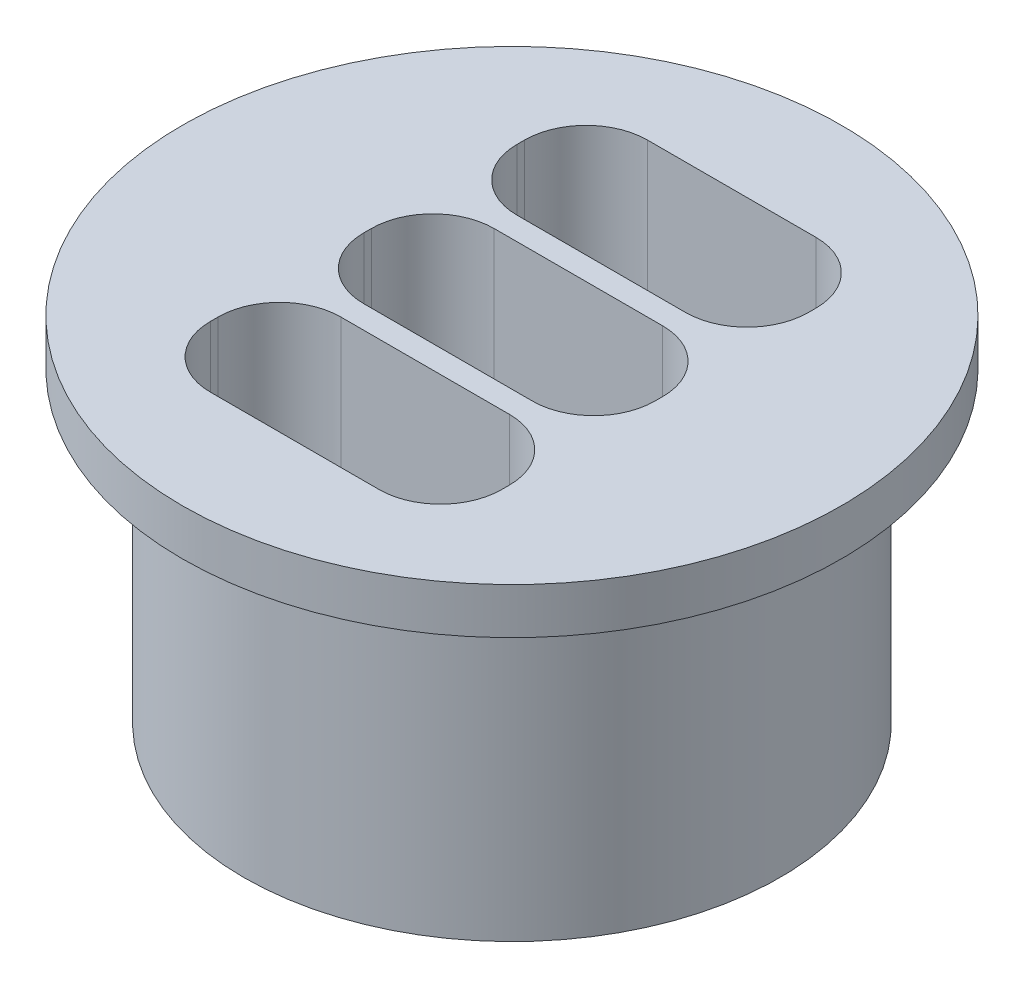
ISO-10303-21;
HEADER;
FILE_DESCRIPTION(('STEP AP214'),'2;1');
FILE_NAME('part.step','',(''),(''),'','','');
FILE_SCHEMA(('AUTOMOTIVE_DESIGN { 1 0 10303 214 1 1 1 1 }'));
ENDSEC;
DATA;
#1=APPLICATION_CONTEXT('core data for automotive mechanical design processes');
#2=APPLICATION_PROTOCOL_DEFINITION('international standard','automotive_design',2000,#1);
#3=PRODUCT_CONTEXT('',#1,'mechanical');
#4=PRODUCT('Part','Part','',(#3));
#5=PRODUCT_RELATED_PRODUCT_CATEGORY('part','',(#4));
#6=PRODUCT_DEFINITION_FORMATION('','',#4);
#7=PRODUCT_DEFINITION_CONTEXT('part definition',#1,'design');
#8=PRODUCT_DEFINITION('design','',#6,#7);
#9=PRODUCT_DEFINITION_SHAPE('','',#8);
#10=(LENGTH_UNIT() NAMED_UNIT(*) SI_UNIT(.MILLI.,.METRE.));
#11=(NAMED_UNIT(*) PLANE_ANGLE_UNIT() SI_UNIT($,.RADIAN.));
#12=(NAMED_UNIT(*) SI_UNIT($,.STERADIAN.) SOLID_ANGLE_UNIT());
#13=UNCERTAINTY_MEASURE_WITH_UNIT(LENGTH_MEASURE(1.E-05),#10,'distance_accuracy_value','');
#14=(GEOMETRIC_REPRESENTATION_CONTEXT(3) GLOBAL_UNCERTAINTY_ASSIGNED_CONTEXT((#13)) GLOBAL_UNIT_ASSIGNED_CONTEXT((#10,
#11,#12)) REPRESENTATION_CONTEXT('',''));
#15=CARTESIAN_POINT('',(0.,0.,0.));
#16=DIRECTION('',(0.,0.,1.));
#17=DIRECTION('',(1.,0.,0.));
#18=AXIS2_PLACEMENT_3D('',#15,#16,#17);
#19=CARTESIAN_POINT('',(0.,20.,0.));
#20=DIRECTION('',(0.,-1.,0.));
#21=DIRECTION('',(0.,0.,-1.));
#22=AXIS2_PLACEMENT_3D('',#19,#20,#21);
#23=CYLINDRICAL_SURFACE('',#22,17.5);
#24=CARTESIAN_POINT('',(0.,20.,0.));
#25=DIRECTION('',(0.,1.,0.));
#26=DIRECTION('',(0.,0.,1.));
#27=AXIS2_PLACEMENT_3D('',#24,#25,#26);
#28=CIRCLE('',#27,17.5);
#29=CARTESIAN_POINT('',(0.,20.,17.5));
#30=VERTEX_POINT('',#29);
#31=EDGE_CURVE('E256',#30,#30,#28,.T.);
#32=ORIENTED_EDGE('',*,*,#31,.F.);
#33=EDGE_LOOP('',(#32));
#34=FACE_BOUND('',#33,.T.);
#35=CARTESIAN_POINT('',(0.,0.,0.));
#36=DIRECTION('',(0.,1.,0.));
#37=DIRECTION('',(0.,0.,1.));
#38=AXIS2_PLACEMENT_3D('',#35,#36,#37);
#39=CIRCLE('',#38,17.5);
#40=CARTESIAN_POINT('',(0.,0.,17.5));
#41=VERTEX_POINT('',#40);
#42=EDGE_CURVE('E250',#41,#41,#39,.T.);
#43=ORIENTED_EDGE('',*,*,#42,.T.);
#44=EDGE_LOOP('',(#43));
#45=FACE_BOUND('',#44,.T.);
#46=ADVANCED_FACE('F39',(#34,#45),#23,.T.);
#47=CARTESIAN_POINT('',(0.,0.,0.));
#48=DIRECTION('',(0.,1.,0.));
#49=DIRECTION('',(0.,0.,1.));
#50=AXIS2_PLACEMENT_3D('',#47,#48,#49);
#51=PLANE('',#50);
#52=DIRECTION('',(0.,0.,1.));
#53=VECTOR('',#52,1.);
#54=CARTESIAN_POINT('',(-9.5,0.,-14.3338110373272));
#55=LINE('',#54,#53);
#56=CARTESIAN_POINT('',(-9.5,0.,-10.3338110373272));
#57=VERTEX_POINT('',#56);
#58=CARTESIAN_POINT('',(-9.5,0.,-9.83381103732719));
#59=VERTEX_POINT('',#58);
#60=EDGE_CURVE('E429',#57,#59,#55,.T.);
#61=ORIENTED_EDGE('',*,*,#60,.T.);
#62=CARTESIAN_POINT('',(-5.5,0.,-9.83381103732719));
#63=DIRECTION('',(0.,1.,0.));
#64=DIRECTION('',(0.,0.,1.));
#65=AXIS2_PLACEMENT_3D('',#62,#63,#64);
#66=CIRCLE('',#65,4.);
#67=CARTESIAN_POINT('',(-5.5,0.,-5.83381103732719));
#68=VERTEX_POINT('',#67);
#69=EDGE_CURVE('E62',#59,#68,#66,.T.);
#70=ORIENTED_EDGE('',*,*,#69,.T.);
#71=DIRECTION('',(1.,0.,0.));
#72=VECTOR('',#71,1.);
#73=CARTESIAN_POINT('',(-9.5,0.,-5.83381103732719));
#74=LINE('',#73,#72);
#75=CARTESIAN_POINT('',(5.5,0.,-5.83381103732719));
#76=VERTEX_POINT('',#75);
#77=EDGE_CURVE('E255',#68,#76,#74,.T.);
#78=ORIENTED_EDGE('',*,*,#77,.T.);
#79=CARTESIAN_POINT('',(5.5,0.,-9.83381103732719));
#80=DIRECTION('',(0.,1.,0.));
#81=DIRECTION('',(0.,0.,1.));
#82=AXIS2_PLACEMENT_3D('',#79,#80,#81);
#83=CIRCLE('',#82,4.);
#84=CARTESIAN_POINT('',(9.5,0.,-9.83381103732719));
#85=VERTEX_POINT('',#84);
#86=EDGE_CURVE('E390',#76,#85,#83,.T.);
#87=ORIENTED_EDGE('',*,*,#86,.T.);
#88=DIRECTION('',(0.,0.,-1.));
#89=VECTOR('',#88,1.);
#90=CARTESIAN_POINT('',(9.5,0.,-14.3338110373272));
#91=LINE('',#90,#89);
#92=CARTESIAN_POINT('',(9.5,0.,-10.3338110373272));
#93=VERTEX_POINT('',#92);
#94=EDGE_CURVE('E424',#85,#93,#91,.T.);
#95=ORIENTED_EDGE('',*,*,#94,.T.);
#96=CARTESIAN_POINT('',(5.5,0.,-10.3338110373272));
#97=DIRECTION('',(0.,1.,0.));
#98=DIRECTION('',(0.,0.,1.));
#99=AXIS2_PLACEMENT_3D('',#96,#97,#98);
#100=CIRCLE('',#99,4.);
#101=CARTESIAN_POINT('',(5.5,0.,-14.3338110373272));
#102=VERTEX_POINT('',#101);
#103=EDGE_CURVE('E11',#93,#102,#100,.T.);
#104=ORIENTED_EDGE('',*,*,#103,.T.);
#105=DIRECTION('',(-1.,0.,0.));
#106=VECTOR('',#105,1.);
#107=CARTESIAN_POINT('',(-9.5,0.,-14.3338110373272));
#108=LINE('',#107,#106);
#109=CARTESIAN_POINT('',(-5.5,0.,-14.3338110373272));
#110=VERTEX_POINT('',#109);
#111=EDGE_CURVE('E422',#102,#110,#108,.T.);
#112=ORIENTED_EDGE('',*,*,#111,.T.);
#113=CARTESIAN_POINT('',(-5.5,0.,-10.3338110373272));
#114=DIRECTION('',(0.,1.,0.));
#115=DIRECTION('',(0.,0.,1.));
#116=AXIS2_PLACEMENT_3D('',#113,#114,#115);
#117=CIRCLE('',#116,4.);
#118=EDGE_CURVE('E384',#110,#57,#117,.T.);
#119=ORIENTED_EDGE('',*,*,#118,.T.);
#120=EDGE_LOOP('',(#61,#70,#78,#87,#95,#104,#112,#119));
#121=FACE_BOUND('',#120,.T.);
#122=DIRECTION('',(-1.,0.,0.));
#123=VECTOR('',#122,1.);
#124=CARTESIAN_POINT('',(-9.4999999999999,0.,-4.33381103732719));
#125=LINE('',#124,#123);
#126=CARTESIAN_POINT('',(5.50000000000011,0.,-4.33381103732719));
#127=VERTEX_POINT('',#126);
#128=CARTESIAN_POINT('',(-5.49999999999989,0.,-4.33381103732719));
#129=VERTEX_POINT('',#128);
#130=EDGE_CURVE('E456',#127,#129,#125,.T.);
#131=ORIENTED_EDGE('',*,*,#130,.T.);
#132=CARTESIAN_POINT('',(-5.49999999999989,0.,-0.333811037327188));
#133=DIRECTION('',(0.,1.,0.));
#134=DIRECTION('',(0.,0.,1.));
#135=AXIS2_PLACEMENT_3D('',#132,#133,#134);
#136=CIRCLE('',#135,4.);
#137=CARTESIAN_POINT('',(-9.49999999999989,0.,-0.333811037327186));
#138=VERTEX_POINT('',#137);
#139=EDGE_CURVE('E345',#129,#138,#136,.T.);
#140=ORIENTED_EDGE('',*,*,#139,.T.);
#141=DIRECTION('',(0.,0.,1.));
#142=VECTOR('',#141,1.);
#143=CARTESIAN_POINT('',(-9.4999999999999,0.,-4.33381103732719));
#144=LINE('',#143,#142);
#145=CARTESIAN_POINT('',(-9.49999999999989,0.,0.166188962672814));
#146=VERTEX_POINT('',#145);
#147=EDGE_CURVE('E415',#138,#146,#144,.T.);
#148=ORIENTED_EDGE('',*,*,#147,.T.);
#149=CARTESIAN_POINT('',(-5.49999999999989,0.,0.166188962672812));
#150=DIRECTION('',(0.,1.,0.));
#151=DIRECTION('',(0.,0.,1.));
#152=AXIS2_PLACEMENT_3D('',#149,#150,#151);
#153=CIRCLE('',#152,4.);
#154=CARTESIAN_POINT('',(-5.49999999999989,0.,4.16618896267281));
#155=VERTEX_POINT('',#154);
#156=EDGE_CURVE('E339',#146,#155,#153,.T.);
#157=ORIENTED_EDGE('',*,*,#156,.T.);
#158=DIRECTION('',(1.,0.,0.));
#159=VECTOR('',#158,1.);
#160=CARTESIAN_POINT('',(-9.49999999999989,0.,4.16618896267281));
#161=LINE('',#160,#159);
#162=CARTESIAN_POINT('',(5.50000000000011,0.,4.16618896267281));
#163=VERTEX_POINT('',#162);
#164=EDGE_CURVE('E447',#155,#163,#161,.T.);
#165=ORIENTED_EDGE('',*,*,#164,.T.);
#166=CARTESIAN_POINT('',(5.50000000000011,0.,0.166188962672812));
#167=DIRECTION('',(0.,1.,0.));
#168=DIRECTION('',(0.,0.,1.));
#169=AXIS2_PLACEMENT_3D('',#166,#167,#168);
#170=CIRCLE('',#169,4.);
#171=CARTESIAN_POINT('',(9.5000000000001,0.,0.166188962672811));
#172=VERTEX_POINT('',#171);
#173=EDGE_CURVE('E333',#163,#172,#170,.T.);
#174=ORIENTED_EDGE('',*,*,#173,.T.);
#175=DIRECTION('',(0.,0.,-1.));
#176=VECTOR('',#175,1.);
#177=CARTESIAN_POINT('',(9.5000000000001,0.,-4.33381103732719));
#178=LINE('',#177,#176);
#179=CARTESIAN_POINT('',(9.5000000000001,0.,-0.33381103732719));
#180=VERTEX_POINT('',#179);
#181=EDGE_CURVE('E451',#172,#180,#178,.T.);
#182=ORIENTED_EDGE('',*,*,#181,.T.);
#183=CARTESIAN_POINT('',(5.50000000000011,0.,-0.333811037327188));
#184=DIRECTION('',(0.,1.,0.));
#185=DIRECTION('',(0.,0.,1.));
#186=AXIS2_PLACEMENT_3D('',#183,#184,#185);
#187=CIRCLE('',#186,4.);
#188=EDGE_CURVE('E351',#180,#127,#187,.T.);
#189=ORIENTED_EDGE('',*,*,#188,.T.);
#190=EDGE_LOOP('',(#131,#140,#148,#157,#165,#174,#182,#189));
#191=FACE_BOUND('',#190,.T.);
#192=DIRECTION('',(-1.,0.,0.));
#193=VECTOR('',#192,1.);
#194=CARTESIAN_POINT('',(-9.49999999999979,0.,5.66618896267281));
#195=LINE('',#194,#193);
#196=CARTESIAN_POINT('',(5.50000000000021,0.,5.66618896267281));
#197=VERTEX_POINT('',#196);
#198=CARTESIAN_POINT('',(-5.49999999999979,0.,5.66618896267281));
#199=VERTEX_POINT('',#198);
#200=EDGE_CURVE('E223',#197,#199,#195,.T.);
#201=ORIENTED_EDGE('',*,*,#200,.T.);
#202=CARTESIAN_POINT('',(-5.49999999999979,0.,9.66618896267281));
#203=DIRECTION('',(0.,1.,0.));
#204=DIRECTION('',(0.,0.,1.));
#205=AXIS2_PLACEMENT_3D('',#202,#203,#204);
#206=CIRCLE('',#205,4.);
#207=CARTESIAN_POINT('',(-9.49999999999979,0.,9.66618896267281));
#208=VERTEX_POINT('',#207);
#209=EDGE_CURVE('E321',#199,#208,#206,.T.);
#210=ORIENTED_EDGE('',*,*,#209,.T.);
#211=DIRECTION('',(0.,0.,1.));
#212=VECTOR('',#211,1.);
#213=CARTESIAN_POINT('',(-9.49999999999979,0.,5.66618896267281));
#214=LINE('',#213,#212);
#215=CARTESIAN_POINT('',(-9.49999999999979,0.,10.1661889626728));
#216=VERTEX_POINT('',#215);
#217=EDGE_CURVE('E468',#208,#216,#214,.T.);
#218=ORIENTED_EDGE('',*,*,#217,.T.);
#219=CARTESIAN_POINT('',(-5.49999999999979,0.,10.1661889626728));
#220=DIRECTION('',(0.,1.,0.));
#221=DIRECTION('',(0.,0.,1.));
#222=AXIS2_PLACEMENT_3D('',#219,#220,#221);
#223=CIRCLE('',#222,4.);
#224=CARTESIAN_POINT('',(-5.49999999999979,0.,14.1661889626728));
#225=VERTEX_POINT('',#224);
#226=EDGE_CURVE('E316',#216,#225,#223,.T.);
#227=ORIENTED_EDGE('',*,*,#226,.T.);
#228=DIRECTION('',(1.,0.,0.));
#229=VECTOR('',#228,1.);
#230=CARTESIAN_POINT('',(-9.49999999999979,0.,14.1661889626728));
#231=LINE('',#230,#229);
#232=CARTESIAN_POINT('',(5.50000000000021,0.,14.1661889626728));
#233=VERTEX_POINT('',#232);
#234=EDGE_CURVE('E240',#225,#233,#231,.T.);
#235=ORIENTED_EDGE('',*,*,#234,.T.);
#236=CARTESIAN_POINT('',(5.50000000000021,0.,10.1661889626728));
#237=DIRECTION('',(0.,1.,0.));
#238=DIRECTION('',(0.,0.,1.));
#239=AXIS2_PLACEMENT_3D('',#236,#237,#238);
#240=CIRCLE('',#239,4.);
#241=CARTESIAN_POINT('',(9.50000000000021,0.,10.1661889626728));
#242=VERTEX_POINT('',#241);
#243=EDGE_CURVE('E327',#233,#242,#240,.T.);
#244=ORIENTED_EDGE('',*,*,#243,.T.);
#245=DIRECTION('',(0.,0.,-1.));
#246=VECTOR('',#245,1.);
#247=CARTESIAN_POINT('',(9.50000000000021,0.,5.66618896267281));
#248=LINE('',#247,#246);
#249=CARTESIAN_POINT('',(9.50000000000021,0.,9.66618896267281));
#250=VERTEX_POINT('',#249);
#251=EDGE_CURVE('E482',#242,#250,#248,.T.);
#252=ORIENTED_EDGE('',*,*,#251,.T.);
#253=CARTESIAN_POINT('',(5.50000000000021,0.,9.66618896267281));
#254=DIRECTION('',(0.,1.,0.));
#255=DIRECTION('',(0.,0.,1.));
#256=AXIS2_PLACEMENT_3D('',#253,#254,#255);
#257=CIRCLE('',#256,4.);
#258=EDGE_CURVE('E213',#250,#197,#257,.T.);
#259=ORIENTED_EDGE('',*,*,#258,.T.);
#260=EDGE_LOOP('',(#201,#210,#218,#227,#235,#244,#252,#259));
#261=FACE_BOUND('',#260,.T.);
#262=ORIENTED_EDGE('',*,*,#42,.F.);
#263=EDGE_LOOP('',(#262));
#264=FACE_BOUND('',#263,.T.);
#265=ADVANCED_FACE('F420',(#121,#191,#261,#264),#51,.F.);
#266=CARTESIAN_POINT('',(0.,23.,0.));
#267=DIRECTION('',(0.,-1.,0.));
#268=DIRECTION('',(0.,0.,-1.));
#269=AXIS2_PLACEMENT_3D('',#266,#267,#268);
#270=CYLINDRICAL_SURFACE('',#269,21.5);
#271=CARTESIAN_POINT('',(0.,23.,0.));
#272=DIRECTION('',(0.,1.,0.));
#273=DIRECTION('',(0.,0.,1.));
#274=AXIS2_PLACEMENT_3D('',#271,#272,#273);
#275=CIRCLE('',#274,21.5);
#276=CARTESIAN_POINT('',(0.,23.,21.5));
#277=VERTEX_POINT('',#276);
#278=EDGE_CURVE('E246',#277,#277,#275,.T.);
#279=ORIENTED_EDGE('',*,*,#278,.F.);
#280=EDGE_LOOP('',(#279));
#281=FACE_BOUND('',#280,.T.);
#282=CARTESIAN_POINT('',(0.,20.,0.));
#283=DIRECTION('',(0.,1.,0.));
#284=DIRECTION('',(0.,0.,1.));
#285=AXIS2_PLACEMENT_3D('',#282,#283,#284);
#286=CIRCLE('',#285,21.5);
#287=CARTESIAN_POINT('',(0.,20.,21.5));
#288=VERTEX_POINT('',#287);
#289=EDGE_CURVE('E251',#288,#288,#286,.T.);
#290=ORIENTED_EDGE('',*,*,#289,.T.);
#291=EDGE_LOOP('',(#290));
#292=FACE_BOUND('',#291,.T.);
#293=ADVANCED_FACE('F525',(#281,#292),#270,.T.);
#294=CARTESIAN_POINT('',(0.,23.,0.));
#295=DIRECTION('',(0.,1.,0.));
#296=DIRECTION('',(0.,0.,1.));
#297=AXIS2_PLACEMENT_3D('',#294,#295,#296);
#298=PLANE('',#297);
#299=DIRECTION('',(0.,0.,-1.));
#300=VECTOR('',#299,1.);
#301=CARTESIAN_POINT('',(9.5,23.,-14.3338110373272));
#302=LINE('',#301,#300);
#303=CARTESIAN_POINT('',(9.5,23.,-9.83381103732719));
#304=VERTEX_POINT('',#303);
#305=CARTESIAN_POINT('',(9.5,23.,-10.3338110373272));
#306=VERTEX_POINT('',#305);
#307=EDGE_CURVE('E403',#304,#306,#302,.T.);
#308=ORIENTED_EDGE('',*,*,#307,.F.);
#309=CARTESIAN_POINT('',(5.5,23.,-9.83381103732719));
#310=DIRECTION('',(0.,1.,0.));
#311=DIRECTION('',(0.,0.,1.));
#312=AXIS2_PLACEMENT_3D('',#309,#310,#311);
#313=CIRCLE('',#312,4.);
#314=CARTESIAN_POINT('',(5.5,23.,-5.83381103732719));
#315=VERTEX_POINT('',#314);
#316=EDGE_CURVE('E387',#304,#315,#313,.F.);
#317=ORIENTED_EDGE('',*,*,#316,.T.);
#318=DIRECTION('',(1.,0.,0.));
#319=VECTOR('',#318,1.);
#320=CARTESIAN_POINT('',(-9.5,23.,-5.83381103732719));
#321=LINE('',#320,#319);
#322=CARTESIAN_POINT('',(-5.5,23.,-5.83381103732719));
#323=VERTEX_POINT('',#322);
#324=EDGE_CURVE('E434',#323,#315,#321,.T.);
#325=ORIENTED_EDGE('',*,*,#324,.F.);
#326=CARTESIAN_POINT('',(-5.5,23.,-9.83381103732719));
#327=DIRECTION('',(0.,1.,0.));
#328=DIRECTION('',(0.,0.,1.));
#329=AXIS2_PLACEMENT_3D('',#326,#327,#328);
#330=CIRCLE('',#329,4.);
#331=CARTESIAN_POINT('',(-9.5,23.,-9.83381103732719));
#332=VERTEX_POINT('',#331);
#333=EDGE_CURVE('E393',#323,#332,#330,.F.);
#334=ORIENTED_EDGE('',*,*,#333,.T.);
#335=DIRECTION('',(0.,0.,1.));
#336=VECTOR('',#335,1.);
#337=CARTESIAN_POINT('',(-9.5,23.,-14.3338110373272));
#338=LINE('',#337,#336);
#339=CARTESIAN_POINT('',(-9.5,23.,-10.3338110373272));
#340=VERTEX_POINT('',#339);
#341=EDGE_CURVE('E441',#340,#332,#338,.T.);
#342=ORIENTED_EDGE('',*,*,#341,.F.);
#343=CARTESIAN_POINT('',(-5.5,23.,-10.3338110373272));
#344=DIRECTION('',(0.,1.,0.));
#345=DIRECTION('',(0.,0.,1.));
#346=AXIS2_PLACEMENT_3D('',#343,#344,#345);
#347=CIRCLE('',#346,4.);
#348=CARTESIAN_POINT('',(-5.5,23.,-14.3338110373272));
#349=VERTEX_POINT('',#348);
#350=EDGE_CURVE('E381',#340,#349,#347,.F.);
#351=ORIENTED_EDGE('',*,*,#350,.T.);
#352=DIRECTION('',(-1.,0.,0.));
#353=VECTOR('',#352,1.);
#354=CARTESIAN_POINT('',(-9.5,23.,-14.3338110373272));
#355=LINE('',#354,#353);
#356=CARTESIAN_POINT('',(5.5,23.,-14.3338110373272));
#357=VERTEX_POINT('',#356);
#358=EDGE_CURVE('E405',#357,#349,#355,.T.);
#359=ORIENTED_EDGE('',*,*,#358,.F.);
#360=CARTESIAN_POINT('',(5.5,23.,-10.3338110373272));
#361=DIRECTION('',(0.,1.,0.));
#362=DIRECTION('',(0.,0.,1.));
#363=AXIS2_PLACEMENT_3D('',#360,#361,#362);
#364=CIRCLE('',#363,4.);
#365=EDGE_CURVE('E48',#357,#306,#364,.F.);
#366=ORIENTED_EDGE('',*,*,#365,.T.);
#367=EDGE_LOOP('',(#308,#317,#325,#334,#342,#351,#359,#366));
#368=FACE_BOUND('',#367,.T.);
#369=DIRECTION('',(1.,0.,0.));
#370=VECTOR('',#369,1.);
#371=CARTESIAN_POINT('',(-9.49999999999989,23.,4.16618896267281));
#372=LINE('',#371,#370);
#373=CARTESIAN_POINT('',(-5.49999999999989,23.,4.16618896267281));
#374=VERTEX_POINT('',#373);
#375=CARTESIAN_POINT('',(5.50000000000011,23.,4.16618896267281));
#376=VERTEX_POINT('',#375);
#377=EDGE_CURVE('E463',#374,#376,#372,.T.);
#378=ORIENTED_EDGE('',*,*,#377,.F.);
#379=CARTESIAN_POINT('',(-5.49999999999989,23.,0.166188962672812));
#380=DIRECTION('',(0.,1.,0.));
#381=DIRECTION('',(0.,0.,1.));
#382=AXIS2_PLACEMENT_3D('',#379,#380,#381);
#383=CIRCLE('',#382,4.);
#384=CARTESIAN_POINT('',(-9.49999999999989,23.,0.166188962672814));
#385=VERTEX_POINT('',#384);
#386=EDGE_CURVE('E336',#374,#385,#383,.F.);
#387=ORIENTED_EDGE('',*,*,#386,.T.);
#388=DIRECTION('',(0.,0.,1.));
#389=VECTOR('',#388,1.);
#390=CARTESIAN_POINT('',(-9.4999999999999,23.,-4.33381103732719));
#391=LINE('',#390,#389);
#392=CARTESIAN_POINT('',(-9.49999999999989,23.,-0.333811037327186));
#393=VERTEX_POINT('',#392);
#394=EDGE_CURVE('E452',#393,#385,#391,.T.);
#395=ORIENTED_EDGE('',*,*,#394,.F.);
#396=CARTESIAN_POINT('',(-5.49999999999989,23.,-0.333811037327188));
#397=DIRECTION('',(0.,1.,0.));
#398=DIRECTION('',(0.,0.,1.));
#399=AXIS2_PLACEMENT_3D('',#396,#397,#398);
#400=CIRCLE('',#399,4.);
#401=CARTESIAN_POINT('',(-5.49999999999989,23.,-4.33381103732719));
#402=VERTEX_POINT('',#401);
#403=EDGE_CURVE('E342',#393,#402,#400,.F.);
#404=ORIENTED_EDGE('',*,*,#403,.T.);
#405=DIRECTION('',(-1.,0.,0.));
#406=VECTOR('',#405,1.);
#407=CARTESIAN_POINT('',(-9.4999999999999,23.,-4.33381103732719));
#408=LINE('',#407,#406);
#409=CARTESIAN_POINT('',(5.50000000000011,23.,-4.33381103732719));
#410=VERTEX_POINT('',#409);
#411=EDGE_CURVE('E472',#410,#402,#408,.T.);
#412=ORIENTED_EDGE('',*,*,#411,.F.);
#413=CARTESIAN_POINT('',(5.50000000000011,23.,-0.333811037327188));
#414=DIRECTION('',(0.,1.,0.));
#415=DIRECTION('',(0.,0.,1.));
#416=AXIS2_PLACEMENT_3D('',#413,#414,#415);
#417=CIRCLE('',#416,4.);
#418=CARTESIAN_POINT('',(9.5000000000001,23.,-0.33381103732719));
#419=VERTEX_POINT('',#418);
#420=EDGE_CURVE('E348',#410,#419,#417,.F.);
#421=ORIENTED_EDGE('',*,*,#420,.T.);
#422=DIRECTION('',(0.,0.,-1.));
#423=VECTOR('',#422,1.);
#424=CARTESIAN_POINT('',(9.5000000000001,23.,-4.33381103732719));
#425=LINE('',#424,#423);
#426=CARTESIAN_POINT('',(9.5000000000001,23.,0.166188962672811));
#427=VERTEX_POINT('',#426);
#428=EDGE_CURVE('E467',#427,#419,#425,.T.);
#429=ORIENTED_EDGE('',*,*,#428,.F.);
#430=CARTESIAN_POINT('',(5.50000000000011,23.,0.166188962672812));
#431=DIRECTION('',(0.,1.,0.));
#432=DIRECTION('',(0.,0.,1.));
#433=AXIS2_PLACEMENT_3D('',#430,#431,#432);
#434=CIRCLE('',#433,4.);
#435=EDGE_CURVE('E330',#427,#376,#434,.F.);
#436=ORIENTED_EDGE('',*,*,#435,.T.);
#437=EDGE_LOOP('',(#378,#387,#395,#404,#412,#421,#429,#436));
#438=FACE_BOUND('',#437,.T.);
#439=DIRECTION('',(1.,0.,0.));
#440=VECTOR('',#439,1.);
#441=CARTESIAN_POINT('',(-9.49999999999979,23.,14.1661889626728));
#442=LINE('',#441,#440);
#443=CARTESIAN_POINT('',(-5.49999999999979,23.,14.1661889626728));
#444=VERTEX_POINT('',#443);
#445=CARTESIAN_POINT('',(5.50000000000021,23.,14.1661889626728));
#446=VERTEX_POINT('',#445);
#447=EDGE_CURVE('E242',#444,#446,#442,.T.);
#448=ORIENTED_EDGE('',*,*,#447,.F.);
#449=CARTESIAN_POINT('',(-5.49999999999979,23.,10.1661889626728));
#450=DIRECTION('',(0.,1.,0.));
#451=DIRECTION('',(0.,0.,1.));
#452=AXIS2_PLACEMENT_3D('',#449,#450,#451);
#453=CIRCLE('',#452,4.);
#454=CARTESIAN_POINT('',(-9.49999999999979,23.,10.1661889626728));
#455=VERTEX_POINT('',#454);
#456=EDGE_CURVE('E313',#444,#455,#453,.F.);
#457=ORIENTED_EDGE('',*,*,#456,.T.);
#458=DIRECTION('',(0.,0.,1.));
#459=VECTOR('',#458,1.);
#460=CARTESIAN_POINT('',(-9.49999999999979,23.,5.66618896267281));
#461=LINE('',#460,#459);
#462=CARTESIAN_POINT('',(-9.49999999999979,23.,9.66618896267281));
#463=VERTEX_POINT('',#462);
#464=EDGE_CURVE('E234',#463,#455,#461,.T.);
#465=ORIENTED_EDGE('',*,*,#464,.F.);
#466=CARTESIAN_POINT('',(-5.49999999999979,23.,9.66618896267281));
#467=DIRECTION('',(0.,1.,0.));
#468=DIRECTION('',(0.,0.,1.));
#469=AXIS2_PLACEMENT_3D('',#466,#467,#468);
#470=CIRCLE('',#469,4.);
#471=CARTESIAN_POINT('',(-5.49999999999979,23.,5.66618896267281));
#472=VERTEX_POINT('',#471);
#473=EDGE_CURVE('E232',#463,#472,#470,.F.);
#474=ORIENTED_EDGE('',*,*,#473,.T.);
#475=DIRECTION('',(-1.,0.,0.));
#476=VECTOR('',#475,1.);
#477=CARTESIAN_POINT('',(-9.49999999999979,23.,5.66618896267281));
#478=LINE('',#477,#476);
#479=CARTESIAN_POINT('',(5.50000000000021,23.,5.66618896267281));
#480=VERTEX_POINT('',#479);
#481=EDGE_CURVE('E220',#480,#472,#478,.T.);
#482=ORIENTED_EDGE('',*,*,#481,.F.);
#483=CARTESIAN_POINT('',(5.50000000000021,23.,9.66618896267281));
#484=DIRECTION('',(0.,1.,0.));
#485=DIRECTION('',(0.,0.,1.));
#486=AXIS2_PLACEMENT_3D('',#483,#484,#485);
#487=CIRCLE('',#486,4.);
#488=CARTESIAN_POINT('',(9.50000000000021,23.,9.66618896267281));
#489=VERTEX_POINT('',#488);
#490=EDGE_CURVE('E202',#480,#489,#487,.F.);
#491=ORIENTED_EDGE('',*,*,#490,.T.);
#492=DIRECTION('',(0.,0.,-1.));
#493=VECTOR('',#492,1.);
#494=CARTESIAN_POINT('',(9.50000000000021,23.,5.66618896267281));
#495=LINE('',#494,#493);
#496=CARTESIAN_POINT('',(9.50000000000021,23.,10.1661889626728));
#497=VERTEX_POINT('',#496);
#498=EDGE_CURVE('E235',#497,#489,#495,.T.);
#499=ORIENTED_EDGE('',*,*,#498,.F.);
#500=CARTESIAN_POINT('',(5.50000000000021,23.,10.1661889626728));
#501=DIRECTION('',(0.,1.,0.));
#502=DIRECTION('',(0.,0.,1.));
#503=AXIS2_PLACEMENT_3D('',#500,#501,#502);
#504=CIRCLE('',#503,4.);
#505=EDGE_CURVE('E324',#497,#446,#504,.F.);
#506=ORIENTED_EDGE('',*,*,#505,.T.);
#507=EDGE_LOOP('',(#448,#457,#465,#474,#482,#491,#499,#506));
#508=FACE_BOUND('',#507,.T.);
#509=ORIENTED_EDGE('',*,*,#278,.T.);
#510=EDGE_LOOP('',(#509));
#511=FACE_BOUND('',#510,.T.);
#512=ADVANCED_FACE('F229',(#368,#438,#508,#511),#298,.T.);
#513=CARTESIAN_POINT('',(0.,20.,0.));
#514=DIRECTION('',(0.,1.,0.));
#515=DIRECTION('',(0.,0.,1.));
#516=AXIS2_PLACEMENT_3D('',#513,#514,#515);
#517=PLANE('',#516);
#518=ORIENTED_EDGE('',*,*,#31,.T.);
#519=EDGE_LOOP('',(#518));
#520=FACE_BOUND('',#519,.T.);
#521=ORIENTED_EDGE('',*,*,#289,.F.);
#522=EDGE_LOOP('',(#521));
#523=FACE_BOUND('',#522,.T.);
#524=ADVANCED_FACE('F609',(#520,#523),#517,.F.);
#525=CARTESIAN_POINT('',(-9.49999999999979,0.,14.1661889626728));
#526=DIRECTION('',(0.,0.,1.));
#527=DIRECTION('',(1.,0.,0.));
#528=AXIS2_PLACEMENT_3D('',#525,#526,#527);
#529=PLANE('',#528);
#530=ORIENTED_EDGE('',*,*,#234,.F.);
#531=DIRECTION('',(0.,1.,0.));
#532=VECTOR('',#531,1.);
#533=CARTESIAN_POINT('',(-5.49999999999979,23.,14.1661889626728));
#534=LINE('',#533,#532);
#535=EDGE_CURVE('E273',#225,#444,#534,.T.);
#536=ORIENTED_EDGE('',*,*,#535,.T.);
#537=ORIENTED_EDGE('',*,*,#447,.T.);
#538=DIRECTION('',(0.,1.,0.));
#539=VECTOR('',#538,1.);
#540=CARTESIAN_POINT('',(5.50000000000021,0.,14.1661889626728));
#541=LINE('',#540,#539);
#542=EDGE_CURVE('E270',#446,#233,#541,.F.);
#543=ORIENTED_EDGE('',*,*,#542,.T.);
#544=EDGE_LOOP('',(#530,#536,#537,#543));
#545=FACE_BOUND('',#544,.T.);
#546=ADVANCED_FACE('F495',(#545),#529,.F.);
#547=CARTESIAN_POINT('',(-9.49999999999979,0.,5.66618896267281));
#548=DIRECTION('',(-1.,0.,0.));
#549=DIRECTION('',(0.,0.,1.));
#550=AXIS2_PLACEMENT_3D('',#547,#548,#549);
#551=PLANE('',#550);
#552=ORIENTED_EDGE('',*,*,#464,.T.);
#553=DIRECTION('',(0.,1.,0.));
#554=VECTOR('',#553,1.);
#555=CARTESIAN_POINT('',(-9.49999999999979,0.,10.1661889626728));
#556=LINE('',#555,#554);
#557=EDGE_CURVE('E281',#455,#216,#556,.F.);
#558=ORIENTED_EDGE('',*,*,#557,.T.);
#559=ORIENTED_EDGE('',*,*,#217,.F.);
#560=DIRECTION('',(0.,1.,0.));
#561=VECTOR('',#560,1.);
#562=CARTESIAN_POINT('',(-9.49999999999979,23.,9.66618896267281));
#563=LINE('',#562,#561);
#564=EDGE_CURVE('E277',#208,#463,#563,.T.);
#565=ORIENTED_EDGE('',*,*,#564,.T.);
#566=EDGE_LOOP('',(#552,#558,#559,#565));
#567=FACE_BOUND('',#566,.T.);
#568=ADVANCED_FACE('F516',(#567),#551,.F.);
#569=CARTESIAN_POINT('',(-9.49999999999979,0.,5.66618896267281));
#570=DIRECTION('',(0.,0.,-1.));
#571=DIRECTION('',(-1.,0.,0.));
#572=AXIS2_PLACEMENT_3D('',#569,#570,#571);
#573=PLANE('',#572);
#574=ORIENTED_EDGE('',*,*,#200,.F.);
#575=DIRECTION('',(0.,1.,0.));
#576=VECTOR('',#575,1.);
#577=CARTESIAN_POINT('',(5.50000000000021,23.,5.66618896267281));
#578=LINE('',#577,#576);
#579=EDGE_CURVE('E206',#197,#480,#578,.T.);
#580=ORIENTED_EDGE('',*,*,#579,.T.);
#581=ORIENTED_EDGE('',*,*,#481,.T.);
#582=DIRECTION('',(0.,1.,0.));
#583=VECTOR('',#582,1.);
#584=CARTESIAN_POINT('',(-5.49999999999979,0.,5.66618896267281));
#585=LINE('',#584,#583);
#586=EDGE_CURVE('E226',#472,#199,#585,.F.);
#587=ORIENTED_EDGE('',*,*,#586,.T.);
#588=EDGE_LOOP('',(#574,#580,#581,#587));
#589=FACE_BOUND('',#588,.T.);
#590=ADVANCED_FACE('F219',(#589),#573,.F.);
#591=CARTESIAN_POINT('',(9.50000000000021,0.,5.66618896267281));
#592=DIRECTION('',(1.,0.,0.));
#593=DIRECTION('',(0.,0.,-1.));
#594=AXIS2_PLACEMENT_3D('',#591,#592,#593);
#595=PLANE('',#594);
#596=ORIENTED_EDGE('',*,*,#498,.T.);
#597=DIRECTION('',(0.,1.,0.));
#598=VECTOR('',#597,1.);
#599=CARTESIAN_POINT('',(9.50000000000021,0.,9.66618896267281));
#600=LINE('',#599,#598);
#601=EDGE_CURVE('E207',#489,#250,#600,.F.);
#602=ORIENTED_EDGE('',*,*,#601,.T.);
#603=ORIENTED_EDGE('',*,*,#251,.F.);
#604=DIRECTION('',(0.,1.,0.));
#605=VECTOR('',#604,1.);
#606=CARTESIAN_POINT('',(9.50000000000021,23.,10.1661889626728));
#607=LINE('',#606,#605);
#608=EDGE_CURVE('E225',#242,#497,#607,.T.);
#609=ORIENTED_EDGE('',*,*,#608,.T.);
#610=EDGE_LOOP('',(#596,#602,#603,#609));
#611=FACE_BOUND('',#610,.T.);
#612=ADVANCED_FACE('F505',(#611),#595,.F.);
#613=CARTESIAN_POINT('',(-9.49999999999989,0.,4.16618896267281));
#614=DIRECTION('',(0.,0.,1.));
#615=DIRECTION('',(1.,0.,0.));
#616=AXIS2_PLACEMENT_3D('',#613,#614,#615);
#617=PLANE('',#616);
#618=ORIENTED_EDGE('',*,*,#377,.T.);
#619=DIRECTION('',(0.,1.,0.));
#620=VECTOR('',#619,1.);
#621=CARTESIAN_POINT('',(5.50000000000011,0.,4.16618896267281));
#622=LINE('',#621,#620);
#623=EDGE_CURVE('E295',#376,#163,#622,.F.);
#624=ORIENTED_EDGE('',*,*,#623,.T.);
#625=ORIENTED_EDGE('',*,*,#164,.F.);
#626=DIRECTION('',(0.,1.,0.));
#627=VECTOR('',#626,1.);
#628=CARTESIAN_POINT('',(-5.49999999999989,23.,4.16618896267281));
#629=LINE('',#628,#627);
#630=EDGE_CURVE('E291',#155,#374,#629,.T.);
#631=ORIENTED_EDGE('',*,*,#630,.T.);
#632=EDGE_LOOP('',(#618,#624,#625,#631));
#633=FACE_BOUND('',#632,.T.);
#634=ADVANCED_FACE('F507',(#633),#617,.F.);
#635=CARTESIAN_POINT('',(-9.4999999999999,0.,-4.33381103732719));
#636=DIRECTION('',(-1.,0.,0.));
#637=DIRECTION('',(0.,0.,1.));
#638=AXIS2_PLACEMENT_3D('',#635,#636,#637);
#639=PLANE('',#638);
#640=ORIENTED_EDGE('',*,*,#394,.T.);
#641=DIRECTION('',(0.,1.,0.));
#642=VECTOR('',#641,1.);
#643=CARTESIAN_POINT('',(-9.49999999999989,0.,0.166188962672814));
#644=LINE('',#643,#642);
#645=EDGE_CURVE('E302',#385,#146,#644,.F.);
#646=ORIENTED_EDGE('',*,*,#645,.T.);
#647=ORIENTED_EDGE('',*,*,#147,.F.);
#648=DIRECTION('',(0.,1.,0.));
#649=VECTOR('',#648,1.);
#650=CARTESIAN_POINT('',(-9.49999999999989,23.,-0.333811037327186));
#651=LINE('',#650,#649);
#652=EDGE_CURVE('E298',#138,#393,#651,.T.);
#653=ORIENTED_EDGE('',*,*,#652,.T.);
#654=EDGE_LOOP('',(#640,#646,#647,#653));
#655=FACE_BOUND('',#654,.T.);
#656=ADVANCED_FACE('F513',(#655),#639,.F.);
#657=CARTESIAN_POINT('',(-9.4999999999999,0.,-4.33381103732719));
#658=DIRECTION('',(0.,0.,-1.));
#659=DIRECTION('',(-1.,0.,0.));
#660=AXIS2_PLACEMENT_3D('',#657,#658,#659);
#661=PLANE('',#660);
#662=ORIENTED_EDGE('',*,*,#411,.T.);
#663=DIRECTION('',(0.,1.,0.));
#664=VECTOR('',#663,1.);
#665=CARTESIAN_POINT('',(-5.49999999999989,0.,-4.33381103732719));
#666=LINE('',#665,#664);
#667=EDGE_CURVE('E214',#402,#129,#666,.F.);
#668=ORIENTED_EDGE('',*,*,#667,.T.);
#669=ORIENTED_EDGE('',*,*,#130,.F.);
#670=DIRECTION('',(0.,1.,0.));
#671=VECTOR('',#670,1.);
#672=CARTESIAN_POINT('',(5.50000000000011,23.,-4.33381103732719));
#673=LINE('',#672,#671);
#674=EDGE_CURVE('E305',#127,#410,#673,.T.);
#675=ORIENTED_EDGE('',*,*,#674,.T.);
#676=EDGE_LOOP('',(#662,#668,#669,#675));
#677=FACE_BOUND('',#676,.T.);
#678=ADVANCED_FACE('F596',(#677),#661,.F.);
#679=CARTESIAN_POINT('',(9.5000000000001,0.,-4.33381103732719));
#680=DIRECTION('',(1.,0.,0.));
#681=DIRECTION('',(0.,0.,-1.));
#682=AXIS2_PLACEMENT_3D('',#679,#680,#681);
#683=PLANE('',#682);
#684=ORIENTED_EDGE('',*,*,#181,.F.);
#685=DIRECTION('',(0.,1.,0.));
#686=VECTOR('',#685,1.);
#687=CARTESIAN_POINT('',(9.5000000000001,23.,0.166188962672811));
#688=LINE('',#687,#686);
#689=EDGE_CURVE('E287',#172,#427,#688,.T.);
#690=ORIENTED_EDGE('',*,*,#689,.T.);
#691=ORIENTED_EDGE('',*,*,#428,.T.);
#692=DIRECTION('',(0.,1.,0.));
#693=VECTOR('',#692,1.);
#694=CARTESIAN_POINT('',(9.5000000000001,0.,-0.33381103732719));
#695=LINE('',#694,#693);
#696=EDGE_CURVE('E284',#419,#180,#695,.F.);
#697=ORIENTED_EDGE('',*,*,#696,.T.);
#698=EDGE_LOOP('',(#684,#690,#691,#697));
#699=FACE_BOUND('',#698,.T.);
#700=ADVANCED_FACE('F593',(#699),#683,.F.);
#701=CARTESIAN_POINT('',(9.5,0.,-14.3338110373272));
#702=DIRECTION('',(1.,0.,0.));
#703=DIRECTION('',(0.,0.,-1.));
#704=AXIS2_PLACEMENT_3D('',#701,#702,#703);
#705=PLANE('',#704);
#706=ORIENTED_EDGE('',*,*,#94,.F.);
#707=DIRECTION('',(0.,1.,0.));
#708=VECTOR('',#707,1.);
#709=CARTESIAN_POINT('',(9.5,23.,-9.83381103732719));
#710=LINE('',#709,#708);
#711=EDGE_CURVE('E371',#85,#304,#710,.T.);
#712=ORIENTED_EDGE('',*,*,#711,.T.);
#713=ORIENTED_EDGE('',*,*,#307,.T.);
#714=DIRECTION('',(0.,1.,0.));
#715=VECTOR('',#714,1.);
#716=CARTESIAN_POINT('',(9.5,0.,-10.3338110373272));
#717=LINE('',#716,#715);
#718=EDGE_CURVE('E368',#306,#93,#717,.F.);
#719=ORIENTED_EDGE('',*,*,#718,.T.);
#720=EDGE_LOOP('',(#706,#712,#713,#719));
#721=FACE_BOUND('',#720,.T.);
#722=ADVANCED_FACE('F411',(#721),#705,.F.);
#723=CARTESIAN_POINT('',(-9.5,0.,-5.83381103732719));
#724=DIRECTION('',(0.,0.,1.));
#725=DIRECTION('',(1.,0.,0.));
#726=AXIS2_PLACEMENT_3D('',#723,#724,#725);
#727=PLANE('',#726);
#728=ORIENTED_EDGE('',*,*,#324,.T.);
#729=DIRECTION('',(0.,1.,0.));
#730=VECTOR('',#729,1.);
#731=CARTESIAN_POINT('',(5.5,0.,-5.83381103732719));
#732=LINE('',#731,#730);
#733=EDGE_CURVE('E55',#315,#76,#732,.F.);
#734=ORIENTED_EDGE('',*,*,#733,.T.);
#735=ORIENTED_EDGE('',*,*,#77,.F.);
#736=DIRECTION('',(0.,1.,0.));
#737=VECTOR('',#736,1.);
#738=CARTESIAN_POINT('',(-5.5,23.,-5.83381103732719));
#739=LINE('',#738,#737);
#740=EDGE_CURVE('E375',#68,#323,#739,.T.);
#741=ORIENTED_EDGE('',*,*,#740,.T.);
#742=EDGE_LOOP('',(#728,#734,#735,#741));
#743=FACE_BOUND('',#742,.T.);
#744=ADVANCED_FACE('F575',(#743),#727,.F.);
#745=CARTESIAN_POINT('',(-9.5,0.,-14.3338110373272));
#746=DIRECTION('',(-1.,0.,0.));
#747=DIRECTION('',(0.,0.,1.));
#748=AXIS2_PLACEMENT_3D('',#745,#746,#747);
#749=PLANE('',#748);
#750=ORIENTED_EDGE('',*,*,#60,.F.);
#751=DIRECTION('',(0.,1.,0.));
#752=VECTOR('',#751,1.);
#753=CARTESIAN_POINT('',(-9.5,23.,-10.3338110373272));
#754=LINE('',#753,#752);
#755=EDGE_CURVE('E357',#57,#340,#754,.T.);
#756=ORIENTED_EDGE('',*,*,#755,.T.);
#757=ORIENTED_EDGE('',*,*,#341,.T.);
#758=DIRECTION('',(0.,1.,0.));
#759=VECTOR('',#758,1.);
#760=CARTESIAN_POINT('',(-9.5,0.,-9.83381103732719));
#761=LINE('',#760,#759);
#762=EDGE_CURVE('E354',#332,#59,#761,.F.);
#763=ORIENTED_EDGE('',*,*,#762,.T.);
#764=EDGE_LOOP('',(#750,#756,#757,#763));
#765=FACE_BOUND('',#764,.T.);
#766=ADVANCED_FACE('F580',(#765),#749,.F.);
#767=CARTESIAN_POINT('',(-9.5,0.,-14.3338110373272));
#768=DIRECTION('',(0.,0.,-1.));
#769=DIRECTION('',(-1.,0.,0.));
#770=AXIS2_PLACEMENT_3D('',#767,#768,#769);
#771=PLANE('',#770);
#772=ORIENTED_EDGE('',*,*,#358,.T.);
#773=DIRECTION('',(0.,1.,0.));
#774=VECTOR('',#773,1.);
#775=CARTESIAN_POINT('',(-5.5,0.,-14.3338110373272));
#776=LINE('',#775,#774);
#777=EDGE_CURVE('E365',#349,#110,#776,.F.);
#778=ORIENTED_EDGE('',*,*,#777,.T.);
#779=ORIENTED_EDGE('',*,*,#111,.F.);
#780=DIRECTION('',(0.,1.,0.));
#781=VECTOR('',#780,1.);
#782=CARTESIAN_POINT('',(5.5,23.,-14.3338110373272));
#783=LINE('',#782,#781);
#784=EDGE_CURVE('E361',#102,#357,#783,.T.);
#785=ORIENTED_EDGE('',*,*,#784,.T.);
#786=EDGE_LOOP('',(#772,#778,#779,#785));
#787=FACE_BOUND('',#786,.T.);
#788=ADVANCED_FACE('F426',(#787),#771,.F.);
#789=CARTESIAN_POINT('',(5.50000000000021,0.,9.66618896267281));
#790=DIRECTION('',(0.,-1.,0.));
#791=DIRECTION('',(0.,0.,-1.));
#792=AXIS2_PLACEMENT_3D('',#789,#790,#791);
#793=CYLINDRICAL_SURFACE('',#792,4.);
#794=ORIENTED_EDGE('',*,*,#258,.F.);
#795=ORIENTED_EDGE('',*,*,#601,.F.);
#796=ORIENTED_EDGE('',*,*,#490,.F.);
#797=ORIENTED_EDGE('',*,*,#579,.F.);
#798=EDGE_LOOP('',(#794,#795,#796,#797));
#799=FACE_BOUND('',#798,.T.);
#800=ADVANCED_FACE('F205',(#799),#793,.F.);
#801=CARTESIAN_POINT('',(-5.49999999999979,0.,10.1661889626728));
#802=DIRECTION('',(0.,-1.,0.));
#803=DIRECTION('',(0.,0.,-1.));
#804=AXIS2_PLACEMENT_3D('',#801,#802,#803);
#805=CYLINDRICAL_SURFACE('',#804,4.);
#806=ORIENTED_EDGE('',*,*,#226,.F.);
#807=ORIENTED_EDGE('',*,*,#557,.F.);
#808=ORIENTED_EDGE('',*,*,#456,.F.);
#809=ORIENTED_EDGE('',*,*,#535,.F.);
#810=EDGE_LOOP('',(#806,#807,#808,#809));
#811=FACE_BOUND('',#810,.T.);
#812=ADVANCED_FACE('F533',(#811),#805,.F.);
#813=CARTESIAN_POINT('',(-5.49999999999979,0.,9.66618896267281));
#814=DIRECTION('',(0.,-1.,0.));
#815=DIRECTION('',(0.,0.,-1.));
#816=AXIS2_PLACEMENT_3D('',#813,#814,#815);
#817=CYLINDRICAL_SURFACE('',#816,4.);
#818=ORIENTED_EDGE('',*,*,#209,.F.);
#819=ORIENTED_EDGE('',*,*,#586,.F.);
#820=ORIENTED_EDGE('',*,*,#473,.F.);
#821=ORIENTED_EDGE('',*,*,#564,.F.);
#822=EDGE_LOOP('',(#818,#819,#820,#821));
#823=FACE_BOUND('',#822,.T.);
#824=ADVANCED_FACE('F536',(#823),#817,.F.);
#825=CARTESIAN_POINT('',(5.50000000000021,0.,10.1661889626728));
#826=DIRECTION('',(0.,-1.,0.));
#827=DIRECTION('',(0.,0.,-1.));
#828=AXIS2_PLACEMENT_3D('',#825,#826,#827);
#829=CYLINDRICAL_SURFACE('',#828,4.);
#830=ORIENTED_EDGE('',*,*,#243,.F.);
#831=ORIENTED_EDGE('',*,*,#542,.F.);
#832=ORIENTED_EDGE('',*,*,#505,.F.);
#833=ORIENTED_EDGE('',*,*,#608,.F.);
#834=EDGE_LOOP('',(#830,#831,#832,#833));
#835=FACE_BOUND('',#834,.T.);
#836=ADVANCED_FACE('F499',(#835),#829,.F.);
#837=CARTESIAN_POINT('',(5.50000000000011,0.,0.166188962672812));
#838=DIRECTION('',(0.,-1.,0.));
#839=DIRECTION('',(0.,0.,-1.));
#840=AXIS2_PLACEMENT_3D('',#837,#838,#839);
#841=CYLINDRICAL_SURFACE('',#840,4.);
#842=ORIENTED_EDGE('',*,*,#173,.F.);
#843=ORIENTED_EDGE('',*,*,#623,.F.);
#844=ORIENTED_EDGE('',*,*,#435,.F.);
#845=ORIENTED_EDGE('',*,*,#689,.F.);
#846=EDGE_LOOP('',(#842,#843,#844,#845));
#847=FACE_BOUND('',#846,.T.);
#848=ADVANCED_FACE('F543',(#847),#841,.F.);
#849=CARTESIAN_POINT('',(-5.49999999999989,0.,0.166188962672812));
#850=DIRECTION('',(0.,-1.,0.));
#851=DIRECTION('',(0.,0.,-1.));
#852=AXIS2_PLACEMENT_3D('',#849,#850,#851);
#853=CYLINDRICAL_SURFACE('',#852,4.);
#854=ORIENTED_EDGE('',*,*,#156,.F.);
#855=ORIENTED_EDGE('',*,*,#645,.F.);
#856=ORIENTED_EDGE('',*,*,#386,.F.);
#857=ORIENTED_EDGE('',*,*,#630,.F.);
#858=EDGE_LOOP('',(#854,#855,#856,#857));
#859=FACE_BOUND('',#858,.T.);
#860=ADVANCED_FACE('F546',(#859),#853,.F.);
#861=CARTESIAN_POINT('',(-5.49999999999989,0.,-0.333811037327188));
#862=DIRECTION('',(0.,-1.,0.));
#863=DIRECTION('',(0.,0.,-1.));
#864=AXIS2_PLACEMENT_3D('',#861,#862,#863);
#865=CYLINDRICAL_SURFACE('',#864,4.);
#866=ORIENTED_EDGE('',*,*,#139,.F.);
#867=ORIENTED_EDGE('',*,*,#667,.F.);
#868=ORIENTED_EDGE('',*,*,#403,.F.);
#869=ORIENTED_EDGE('',*,*,#652,.F.);
#870=EDGE_LOOP('',(#866,#867,#868,#869));
#871=FACE_BOUND('',#870,.T.);
#872=ADVANCED_FACE('F550',(#871),#865,.F.);
#873=CARTESIAN_POINT('',(5.50000000000011,0.,-0.333811037327188));
#874=DIRECTION('',(0.,-1.,0.));
#875=DIRECTION('',(0.,0.,-1.));
#876=AXIS2_PLACEMENT_3D('',#873,#874,#875);
#877=CYLINDRICAL_SURFACE('',#876,4.);
#878=ORIENTED_EDGE('',*,*,#188,.F.);
#879=ORIENTED_EDGE('',*,*,#696,.F.);
#880=ORIENTED_EDGE('',*,*,#420,.F.);
#881=ORIENTED_EDGE('',*,*,#674,.F.);
#882=EDGE_LOOP('',(#878,#879,#880,#881));
#883=FACE_BOUND('',#882,.T.);
#884=ADVANCED_FACE('F554',(#883),#877,.F.);
#885=CARTESIAN_POINT('',(-5.5,0.,-10.3338110373272));
#886=DIRECTION('',(0.,-1.,0.));
#887=DIRECTION('',(0.,0.,-1.));
#888=AXIS2_PLACEMENT_3D('',#885,#886,#887);
#889=CYLINDRICAL_SURFACE('',#888,4.);
#890=ORIENTED_EDGE('',*,*,#118,.F.);
#891=ORIENTED_EDGE('',*,*,#777,.F.);
#892=ORIENTED_EDGE('',*,*,#350,.F.);
#893=ORIENTED_EDGE('',*,*,#755,.F.);
#894=EDGE_LOOP('',(#890,#891,#892,#893));
#895=FACE_BOUND('',#894,.T.);
#896=ADVANCED_FACE('F558',(#895),#889,.F.);
#897=CARTESIAN_POINT('',(5.5,0.,-9.83381103732719));
#898=DIRECTION('',(0.,-1.,0.));
#899=DIRECTION('',(0.,0.,-1.));
#900=AXIS2_PLACEMENT_3D('',#897,#898,#899);
#901=CYLINDRICAL_SURFACE('',#900,4.);
#902=ORIENTED_EDGE('',*,*,#86,.F.);
#903=ORIENTED_EDGE('',*,*,#733,.F.);
#904=ORIENTED_EDGE('',*,*,#316,.F.);
#905=ORIENTED_EDGE('',*,*,#711,.F.);
#906=EDGE_LOOP('',(#902,#903,#904,#905));
#907=FACE_BOUND('',#906,.T.);
#908=ADVANCED_FACE('F562',(#907),#901,.F.);
#909=CARTESIAN_POINT('',(-5.5,0.,-9.83381103732719));
#910=DIRECTION('',(0.,-1.,0.));
#911=DIRECTION('',(0.,0.,-1.));
#912=AXIS2_PLACEMENT_3D('',#909,#910,#911);
#913=CYLINDRICAL_SURFACE('',#912,4.);
#914=ORIENTED_EDGE('',*,*,#69,.F.);
#915=ORIENTED_EDGE('',*,*,#762,.F.);
#916=ORIENTED_EDGE('',*,*,#333,.F.);
#917=ORIENTED_EDGE('',*,*,#740,.F.);
#918=EDGE_LOOP('',(#914,#915,#916,#917));
#919=FACE_BOUND('',#918,.T.);
#920=ADVANCED_FACE('F565',(#919),#913,.F.);
#921=CARTESIAN_POINT('',(5.5,0.,-10.3338110373272));
#922=DIRECTION('',(0.,-1.,0.));
#923=DIRECTION('',(0.,0.,-1.));
#924=AXIS2_PLACEMENT_3D('',#921,#922,#923);
#925=CYLINDRICAL_SURFACE('',#924,4.);
#926=ORIENTED_EDGE('',*,*,#103,.F.);
#927=ORIENTED_EDGE('',*,*,#718,.F.);
#928=ORIENTED_EDGE('',*,*,#365,.F.);
#929=ORIENTED_EDGE('',*,*,#784,.F.);
#930=EDGE_LOOP('',(#926,#927,#928,#929));
#931=FACE_BOUND('',#930,.T.);
#932=ADVANCED_FACE('F41',(#931),#925,.F.);
#933=CLOSED_SHELL('',(#46,#265,#293,#512,#524,#546,#568,#590,#612,#634,#656,#678,#700,#722,#744,
#766,#788,#800,#812,#824,#836,#848,#860,#872,#884,#896,#908,#920,#932));
#934=MANIFOLD_SOLID_BREP('B2',#933);
#935=ADVANCED_BREP_SHAPE_REPRESENTATION('',(#18,#934),#14);
#936=SHAPE_DEFINITION_REPRESENTATION(#9,#935);
ENDSEC;
END-ISO-10303-21;
